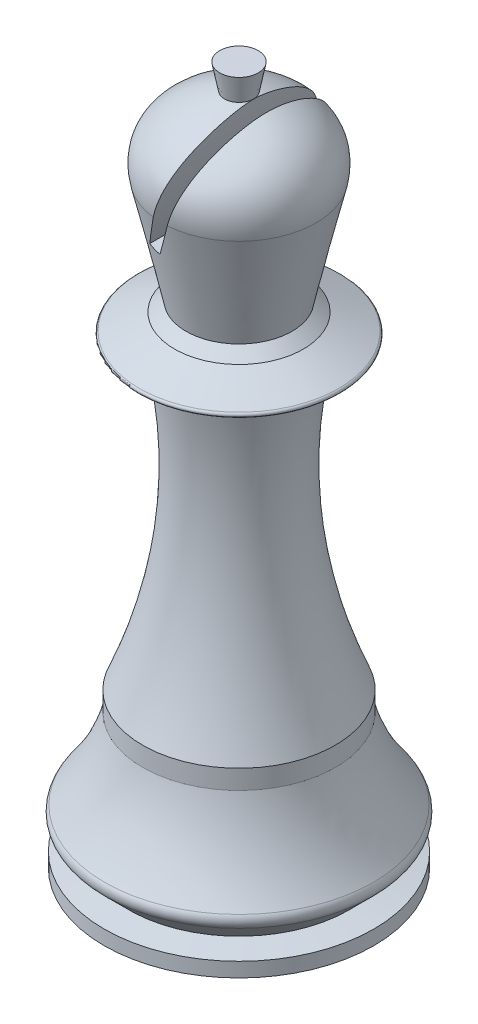
ISO-10303-21;
HEADER;
FILE_DESCRIPTION(('STEP AP214'),'2;1');
FILE_NAME('part.step','',(''),(''),'','','');
FILE_SCHEMA(('AUTOMOTIVE_DESIGN { 1 0 10303 214 1 1 1 1 }'));
ENDSEC;
DATA;
#1=APPLICATION_CONTEXT('core data for automotive mechanical design processes');
#2=APPLICATION_PROTOCOL_DEFINITION('international standard','automotive_design',2000,#1);
#3=PRODUCT_CONTEXT('',#1,'mechanical');
#4=PRODUCT('Part','Part','',(#3));
#5=PRODUCT_RELATED_PRODUCT_CATEGORY('part','',(#4));
#6=PRODUCT_DEFINITION_FORMATION('','',#4);
#7=PRODUCT_DEFINITION_CONTEXT('part definition',#1,'design');
#8=PRODUCT_DEFINITION('design','',#6,#7);
#9=PRODUCT_DEFINITION_SHAPE('','',#8);
#10=(LENGTH_UNIT() NAMED_UNIT(*) SI_UNIT(.MILLI.,.METRE.));
#11=(NAMED_UNIT(*) PLANE_ANGLE_UNIT() SI_UNIT($,.RADIAN.));
#12=(NAMED_UNIT(*) SI_UNIT($,.STERADIAN.) SOLID_ANGLE_UNIT());
#13=UNCERTAINTY_MEASURE_WITH_UNIT(LENGTH_MEASURE(1.E-05),#10,'distance_accuracy_value','');
#14=(GEOMETRIC_REPRESENTATION_CONTEXT(3) GLOBAL_UNCERTAINTY_ASSIGNED_CONTEXT((#13)) GLOBAL_UNIT_ASSIGNED_CONTEXT((#10,
#11,#12)) REPRESENTATION_CONTEXT('',''));
#15=CARTESIAN_POINT('',(0.,0.,0.));
#16=DIRECTION('',(0.,0.,1.));
#17=DIRECTION('',(1.,0.,0.));
#18=AXIS2_PLACEMENT_3D('',#15,#16,#17);
#19=CARTESIAN_POINT('',(8.,61.970366821396,0.));
#20=CARTESIAN_POINT('',(9.00820559247784,66.7482351537256,0.));
#21=CARTESIAN_POINT('',(4.83118187357688,68.8516572764192,0.));
#22=CARTESIAN_POINT('',(1.5,69.8668460847592,0.));
#23=B_SPLINE_CURVE_WITH_KNOTS('',3,(#19,#20,#21,#22),.UNSPECIFIED.,.F.,.F.,(4,4),(0.,1.),.UNSPECIFIED.);
#24=CARTESIAN_POINT('',(0.,69.970366821396,0.));
#25=DIRECTION('',(0.,1.,0.));
#26=AXIS1_PLACEMENT('',#24,#25);
#27=SURFACE_OF_REVOLUTION('',#23,#26);
#28=CARTESIAN_POINT('',(0.,61.970366821396,0.));
#29=DIRECTION('',(0.,1.,0.));
#30=DIRECTION('',(-1.,0.,0.));
#31=AXIS2_PLACEMENT_3D('',#28,#29,#30);
#32=CIRCLE('',#31,8.);
#33=CARTESIAN_POINT('',(0.534835953692726,61.970366821396,7.98210188500734));
#34=VERTEX_POINT('',#33);
#35=CARTESIAN_POINT('',(0.534835953692727,61.970366821396,-7.98210188500734));
#36=VERTEX_POINT('',#35);
#37=EDGE_CURVE('E191',#34,#36,#32,.T.);
#38=ORIENTED_EDGE('',*,*,#37,.T.);
#39=CARTESIAN_POINT('',(0.53483595369273,61.970366821396,-7.98210188500733));
#40=CARTESIAN_POINT('',(0.578248073847116,62.0784401438668,-8.00204917051532));
#41=CARTESIAN_POINT('',(0.621476780237141,62.1870817611524,-8.01942855153003));
#42=CARTESIAN_POINT('',(0.707548439255658,62.4054863762713,-8.04867899450786));
#43=CARTESIAN_POINT('',(0.750390539111129,62.5152510651595,-8.06053989679689));
#44=CARTESIAN_POINT('',(0.835534248462968,62.7355510942813,-8.07830979721081));
#45=CARTESIAN_POINT('',(0.877835537763532,62.8460868361471,-8.08421541715229));
#46=CARTESIAN_POINT('',(0.961932335548767,63.0680439884857,-8.08967261393527));
#47=CARTESIAN_POINT('',(1.00372498017465,63.1794671692388,-8.08919744883406));
#48=CARTESIAN_POINT('',(1.08646974763353,63.4023286574135,-8.08144527813009));
#49=CARTESIAN_POINT('',(1.1274223191167,63.5137669229821,-8.0741720051694));
#50=CARTESIAN_POINT('',(1.20835295750824,63.7362648099618,-8.05249569970204));
#51=CARTESIAN_POINT('',(1.24833132799302,63.8473245398065,-8.03809491883728));
#52=CARTESIAN_POINT('',(1.33781512957097,64.0984932600098,-7.99700684823349));
#53=CARTESIAN_POINT('',(1.38698288561287,64.2383606832297,-7.96805368294083));
#54=CARTESIAN_POINT('',(1.48321811357185,64.5157320239732,-7.8978877152229));
#55=CARTESIAN_POINT('',(1.5302855360558,64.6532358858217,-7.85667462442473));
#56=CARTESIAN_POINT('',(1.62189547932326,64.924368462772,-7.76212866017743));
#57=CARTESIAN_POINT('',(1.66644523129193,65.0580076746154,-7.70883295904614));
#58=CARTESIAN_POINT('',(1.75293932752481,65.3207979064284,-7.59038975800287));
#59=CARTESIAN_POINT('',(1.79488368625388,65.449948951314,-7.52524232389827));
#60=CARTESIAN_POINT('',(1.87596178634435,65.7027170473521,-7.38382880892069));
#61=CARTESIAN_POINT('',(1.91509867912382,65.826340242935,-7.30757549554513));
#62=CARTESIAN_POINT('',(1.99053986328471,66.0675151985333,-7.14478958892181));
#63=CARTESIAN_POINT('',(2.0268441618533,66.1850669739536,-7.05825702175711));
#64=CARTESIAN_POINT('',(2.09666194186866,66.4137524253518,-6.87586250118639));
#65=CARTESIAN_POINT('',(2.13017270067729,66.5248798084025,-6.77999163930094));
#66=CARTESIAN_POINT('',(2.19445542268015,66.7404097973101,-6.58003862519069));
#67=CARTESIAN_POINT('',(2.22522588200872,66.8448087020269,-6.4759520225834));
#68=CARTESIAN_POINT('',(2.29772520577298,67.0933660212783,-6.21100260429954));
#69=CARTESIAN_POINT('',(2.33796408021475,67.2336586737514,-6.0460920494396));
#70=CARTESIAN_POINT('',(2.41332383329704,67.5000335258428,-5.70405152328033));
#71=CARTESIAN_POINT('',(2.44844197588729,67.6261081205409,-5.52691509351923));
#72=CARTESIAN_POINT('',(2.51421073927249,67.8651905184621,-5.16215528290196));
#73=CARTESIAN_POINT('',(2.5448410548901,67.9781384813933,-4.97448924828309));
#74=CARTESIAN_POINT('',(2.60192827703927,68.1910432837729,-4.59136773421476));
#75=CARTESIAN_POINT('',(2.62838537050774,68.2910007050893,-4.39591260416457));
#76=CARTESIAN_POINT('',(2.67471335028323,68.4678101461697,-4.02135595347143));
#77=CARTESIAN_POINT('',(2.6949912364531,68.5459971399531,-3.84293069621768));
#78=CARTESIAN_POINT('',(2.73277264903776,68.6928510025025,-3.48186406735148));
#79=CARTESIAN_POINT('',(2.75027542788745,68.761515305401,-3.29922157481857));
#80=CARTESIAN_POINT('',(2.78261039261548,68.8892605363006,-2.93029316885146));
#81=CARTESIAN_POINT('',(2.79744139739984,68.9483372248283,-2.7440056842429));
#82=CARTESIAN_POINT('',(2.82435952371665,69.0561963941671,-2.36925374779074));
#83=CARTESIAN_POINT('',(2.83645960819063,69.1050274270978,-2.18080424226932));
#84=CARTESIAN_POINT('',(2.85789566079208,69.1919380141196,-1.80134524198184));
#85=CARTESIAN_POINT('',(2.86723267446328,69.2300216347692,-1.61033674420853));
#86=CARTESIAN_POINT('',(2.88294021525425,69.2942971996794,-1.22626075786964));
#87=CARTESIAN_POINT('',(2.88931192009693,69.3204938649434,-1.03319411794826));
#88=CARTESIAN_POINT('',(2.898728615058,69.3592733945348,-0.650563459545809));
#89=CARTESIAN_POINT('',(2.90185413701353,69.3721857375679,-0.461035336280652));
#90=CARTESIAN_POINT('',(2.90490341928859,69.3847826173665,-0.0814669961231008));
#91=CARTESIAN_POINT('',(2.90482655217017,69.3844645619254,0.10857331382765));
#92=CARTESIAN_POINT('',(2.90147395879796,69.3706157265811,0.488112813790388));
#93=CARTESIAN_POINT('',(2.8981985715723,69.3570863470165,0.677612059017686));
#94=CARTESIAN_POINT('',(2.88859951465409,69.3175648891484,1.05575542394565));
#95=CARTESIAN_POINT('',(2.88226714373377,69.2915372375907,1.24439554160072));
#96=CARTESIAN_POINT('',(2.8667769543981,69.2281629684164,1.61967290239496));
#97=CARTESIAN_POINT('',(2.85761842075592,69.1908134855868,1.80630962614191));
#98=CARTESIAN_POINT('',(2.83666617594678,69.1058654228157,2.17709066226512));
#99=CARTESIAN_POINT('',(2.824872229597,69.0582659281826,2.36123475064354));
#100=CARTESIAN_POINT('',(2.80064325536387,68.9611548147941,2.70012987040346));
#101=CARTESIAN_POINT('',(2.78854875295653,68.9129196891685,2.85527362359829));
#102=CARTESIAN_POINT('',(2.76251579200016,68.8097771802947,3.16310962500207));
#103=CARTESIAN_POINT('',(2.74857799376161,68.7548721869157,3.31580272922768));
#104=CARTESIAN_POINT('',(2.71881044883495,68.6384621763262,3.61847872933636));
#105=CARTESIAN_POINT('',(2.70298057622307,68.576956719861,3.76846144406853));
#106=CARTESIAN_POINT('',(2.66936161220449,68.4473747822673,4.0651241713372));
#107=CARTESIAN_POINT('',(2.65157486615007,68.3793061790458,4.21180788910546));
#108=CARTESIAN_POINT('',(2.61389837894279,68.236367563342,4.50156377482297));
#109=CARTESIAN_POINT('',(2.59400871986199,68.1614978163096,4.64463608344783));
#110=CARTESIAN_POINT('',(2.55197817234946,68.0047660341975,4.92646977170909));
#111=CARTESIAN_POINT('',(2.52983774748534,67.9229054395057,5.06523203138769));
#112=CARTESIAN_POINT('',(2.45434865163817,67.6465763032446,5.50551450694555));
#113=CARTESIAN_POINT('',(2.39609084158585,67.4373734232772,5.79744139527686));
#114=CARTESIAN_POINT('',(2.29796463142651,67.0945193073289,6.20785269064008));
#115=CARTESIAN_POINT('',(2.26348604265967,66.9754602329392,6.34001695883857));
#116=CARTESIAN_POINT('',(2.19065043245322,66.7274278023996,6.59360883029425));
#117=CARTESIAN_POINT('',(2.15229407925964,66.5984561553753,6.7150382767205));
#118=CARTESIAN_POINT('',(2.07774670798809,66.3514469269135,6.92751994087815));
#119=CARTESIAN_POINT('',(2.0421309326032,66.234781341631,7.02037112527957));
#120=CARTESIAN_POINT('',(1.96795261358776,65.994895530155,7.1958856826278));
#121=CARTESIAN_POINT('',(1.92939036296265,65.8716759560771,7.278550066447));
#122=CARTESIAN_POINT('',(1.84939376673229,65.6194188561563,7.43259024028926));
#123=CARTESIAN_POINT('',(1.80796220090675,65.4903870024518,7.50397674217486));
#124=CARTESIAN_POINT('',(1.72232272130267,65.227254702115,7.6347463845447));
#125=CARTESIAN_POINT('',(1.67811481373345,65.0931542668189,7.69412955187329));
#126=CARTESIAN_POINT('',(1.58713824477781,64.8209331847579,7.80038903238915));
#127=CARTESIAN_POINT('',(1.54036963721879,64.6828126225271,7.84726560835066));
#128=CARTESIAN_POINT('',(1.44454998643246,64.4036849360872,7.92837409591659));
#129=CARTESIAN_POINT('',(1.39549883388348,64.2626776738023,7.96260540117704));
#130=CARTESIAN_POINT('',(1.29531269231276,63.9785757192432,8.01869772712675));
#131=CARTESIAN_POINT('',(1.2441730373806,63.8354768696887,8.04052921946331));
#132=CARTESIAN_POINT('',(1.14025962564182,63.5486035661954,8.07220960206265));
#133=CARTESIAN_POINT('',(1.08748602862569,63.4048291794796,8.08205966027159));
#134=CARTESIAN_POINT('',(0.953049181679102,63.0434058453686,8.09266412408669));
#135=CARTESIAN_POINT('',(0.87050266369623,62.825838308302,8.08612327856477));
#136=CARTESIAN_POINT('',(0.745361113708041,62.502343128492,8.05920471707769));
#137=CARTESIAN_POINT('',(0.703544060582202,62.3952787064052,8.04743641902176));
#138=CARTESIAN_POINT('',(0.619491871695956,62.1820951838672,8.01862731014028));
#139=CARTESIAN_POINT('',(0.577256986309394,62.0759755820561,8.00158949121919));
#140=CARTESIAN_POINT('',(0.534835953692732,61.970366821396,7.98210188500734));
#141=B_SPLINE_CURVE_WITH_KNOTS('',3,(#39,#40,#41,#42,#43,#44,#45,#46,#47,#48,#49,#50,#51,#52,
#53,#54,#55,#56,#57,#58,#59,#60,#61,#62,#63,#64,#65,#66,#67,#68,#69,#70,#71,#72,#73,#74,#75,#76,
#77,#78,#79,#80,#81,#82,#83,#84,#85,#86,#87,#88,#89,#90,#91,#92,#93,#94,#95,#96,#97,#98,#99,
#100,#101,#102,#103,#104,#105,#106,#107,#108,#109,#110,#111,#112,#113,#114,#115,#116,#117,#118,
#119,#120,#121,#122,#123,#124,#125,#126,#127,#128,#129,#130,#131,#132,#133,#134,#135,#136,#137,
#138,#139,#140),.UNSPECIFIED.,.F.,.F.,(4,2,2,2,2,2,2,2,2,2,2,2,2,2,2,2,2,2,2,2,2,2,2,2,2,2,2,2,
2,2,2,2,2,2,2,2,2,2,2,2,2,2,2,2,2,2,2,2,2,2,4),(0.,0.354485928617171,0.709621918290781,
1.06495924867334,1.4217862649791,1.77841747303533,2.13493609002427,2.58758327804275,
3.04024111388357,3.49152479820131,3.94280597681864,4.39357239151397,4.84433766243676,
5.29553724307847,5.74698293371819,6.40660848926784,7.0665852069165,7.72946142730708,
8.39230794613157,8.97957962456564,9.56700923585299,10.1546978945271,10.7395353658363,
11.3241512513111,11.9085347480541,12.4780468688758,13.0476705736423,13.6172339075187,
14.1884280596426,14.7597668845743,15.3311567158514,15.819751182737,16.3081710956757,
16.7966235326869,17.2844967990258,17.7723510317663,18.2601049888609,19.3473923827849,
19.89048930341,20.4334927924354,20.8929275101506,21.3523165997516,21.8112666984164,
22.2702157706705,22.7291551992509,23.1881166312393,23.6481664794806,24.1081714786229,
24.8050433895983,25.1515737647633,25.4979077485702),.UNSPECIFIED.);
#142=EDGE_CURVE('E140',#36,#34,#141,.T.);
#143=ORIENTED_EDGE('',*,*,#142,.T.);
#144=EDGE_LOOP('',(#38,#143));
#145=FACE_BOUND('',#144,.T.);
#146=ADVANCED_FACE('F32',(#145),#27,.T.);
#147=CARTESIAN_POINT('',(0.,-0.0296331786040218,0.));
#148=DIRECTION('',(0.,1.,0.));
#149=DIRECTION('',(-1.,0.,0.));
#150=AXIS2_PLACEMENT_3D('',#147,#148,#149);
#151=PLANE('',#150);
#152=CARTESIAN_POINT('',(0.,-0.0296331786040216,0.));
#153=DIRECTION('',(0.,1.,0.));
#154=DIRECTION('',(-1.,0.,0.));
#155=AXIS2_PLACEMENT_3D('',#152,#153,#154);
#156=CIRCLE('',#155,14.);
#157=CARTESIAN_POINT('',(-14.,-0.0296331786040219,0.));
#158=VERTEX_POINT('',#157);
#159=EDGE_CURVE('E163',#158,#158,#156,.T.);
#160=ORIENTED_EDGE('',*,*,#159,.F.);
#161=EDGE_LOOP('',(#160));
#162=FACE_BOUND('',#161,.T.);
#163=ADVANCED_FACE('F217',(#162),#151,.F.);
#164=CARTESIAN_POINT('',(0.,72.470366821396,0.));
#165=DIRECTION('',(0.,-1.,0.));
#166=DIRECTION('',(1.,0.,0.));
#167=AXIS2_PLACEMENT_3D('',#164,#165,#166);
#168=PLANE('',#167);
#169=CARTESIAN_POINT('',(0.,72.470366821396,0.));
#170=DIRECTION('',(0.,1.,0.));
#171=DIRECTION('',(-1.,0.,0.));
#172=AXIS2_PLACEMENT_3D('',#169,#170,#171);
#173=CIRCLE('',#172,2.);
#174=CARTESIAN_POINT('',(-2.,72.470366821396,0.));
#175=VERTEX_POINT('',#174);
#176=EDGE_CURVE('E195',#175,#175,#173,.T.);
#177=ORIENTED_EDGE('',*,*,#176,.T.);
#178=EDGE_LOOP('',(#177));
#179=FACE_BOUND('',#178,.T.);
#180=ADVANCED_FACE('F221',(#179),#168,.F.);
#181=CARTESIAN_POINT('',(0.,69.8668460847592,0.));
#182=DIRECTION('',(0.,1.,0.));
#183=DIRECTION('',(-1.,0.,0.));
#184=AXIS2_PLACEMENT_3D('',#181,#182,#183);
#185=CONICAL_SURFACE('',#184,1.5,0.189737492979221);
#186=ORIENTED_EDGE('',*,*,#176,.F.);
#187=EDGE_LOOP('',(#186));
#188=FACE_BOUND('',#187,.T.);
#189=CARTESIAN_POINT('',(0.,69.8668460847592,0.));
#190=DIRECTION('',(0.,1.,0.));
#191=DIRECTION('',(-1.,0.,0.));
#192=AXIS2_PLACEMENT_3D('',#189,#190,#191);
#193=CIRCLE('',#192,1.5);
#194=CARTESIAN_POINT('',(-1.5,69.8668460847592,0.));
#195=VERTEX_POINT('',#194);
#196=EDGE_CURVE('E192',#195,#195,#193,.T.);
#197=ORIENTED_EDGE('',*,*,#196,.T.);
#198=EDGE_LOOP('',(#197));
#199=FACE_BOUND('',#198,.T.);
#200=ADVANCED_FACE('F151',(#188,#199),#185,.T.);
#201=ORIENTED_EDGE('',*,*,#196,.F.);
#202=EDGE_LOOP('',(#201));
#203=FACE_BOUND('',#202,.T.);
#204=CARTESIAN_POINT('',(-0.96531922475324,61.970366821396,-7.94154637298819));
#205=VERTEX_POINT('',#204);
#206=CARTESIAN_POINT('',(-0.965319224753239,61.970366821396,7.94154637298819));
#207=VERTEX_POINT('',#206);
#208=EDGE_CURVE('E98',#205,#207,#32,.T.);
#209=ORIENTED_EDGE('',*,*,#208,.T.);
#210=CARTESIAN_POINT('',(-0.965319224753241,61.970366821396,7.94154637298819));
#211=CARTESIAN_POINT('',(-0.923115019764991,62.0754164507909,7.96900532859042));
#212=CARTESIAN_POINT('',(-0.881012714847106,62.1811788022909,7.99396973155064));
#213=CARTESIAN_POINT('',(-0.797027605055707,62.3941409557227,8.03855791772596));
#214=CARTESIAN_POINT('',(-0.755145349225603,62.5013430518232,8.05817175167221));
#215=CARTESIAN_POINT('',(-0.671748449055315,62.7168697794648,8.09161262505578));
#216=CARTESIAN_POINT('',(-0.630234032047347,62.8251950260817,8.10543630115832));
#217=CARTESIAN_POINT('',(-0.54752001541522,63.0431527657534,8.1269215267443));
#218=CARTESIAN_POINT('',(-0.506322724591494,63.1527889719581,8.13455459888822));
#219=CARTESIAN_POINT('',(-0.424585006986918,63.37250696438,8.14314584529181));
#220=CARTESIAN_POINT('',(-0.384044231036156,63.4825884720327,8.1441076923267));
#221=CARTESIAN_POINT('',(-0.303751631682722,63.7028378285285,8.1389945639395));
#222=CARTESIAN_POINT('',(-0.263999558714682,63.8130056382125,8.13292185174799));
#223=CARTESIAN_POINT('',(-0.175533007161214,64.0607137478687,8.11096614112886));
#224=CARTESIAN_POINT('',(-0.127078784787141,64.1981701388419,8.09300003384211));
#225=CARTESIAN_POINT('',(-0.0319293021507873,64.471608238056,8.04510122944678));
#226=CARTESIAN_POINT('',(0.0147659361477167,64.6075899278676,8.01516838296818));
#227=CARTESIAN_POINT('',(0.105973688836415,64.8766509175958,7.94327381408066));
#228=CARTESIAN_POINT('',(0.150491831677386,65.0097371473245,7.90134526511549));
#229=CARTESIAN_POINT('',(0.237218025345246,65.2723334273208,7.80559261718437));
#230=CARTESIAN_POINT('',(0.279426100751869,65.4018435156323,7.75176864481962));
#231=CARTESIAN_POINT('',(0.361343117508346,65.6563646975656,7.63270040282973));
#232=CARTESIAN_POINT('',(0.401051364347402,65.7813745368189,7.56745297837311));
#233=CARTESIAN_POINT('',(0.477833645290183,66.0260699898455,7.42632055171477));
#234=CARTESIAN_POINT('',(0.514907670750515,66.1457555861485,7.3504355146114));
#235=CARTESIAN_POINT('',(0.586375329230235,66.3792128979134,7.18901123319237));
#236=CARTESIAN_POINT('',(0.620769557768505,66.492985925416,7.10347414421125));
#237=CARTESIAN_POINT('',(0.686930589900172,66.7143366812645,6.92378161698758));
#238=CARTESIAN_POINT('',(0.718696687832206,66.8219127433658,6.82962387827774));
#239=CARTESIAN_POINT('',(0.793083100382043,67.076567838345,6.59076856492964));
#240=CARTESIAN_POINT('',(0.834347887771038,67.2202612368626,6.44202741162685));
#241=CARTESIAN_POINT('',(0.912055516977583,67.4947472510702,6.13190151445469));
#242=CARTESIAN_POINT('',(0.948495807130659,67.6255330307185,5.97051015118987));
#243=CARTESIAN_POINT('',(1.01731570681384,67.8758146422563,5.63635096193235));
#244=CARTESIAN_POINT('',(1.04966031792706,67.9952112632156,5.46350211125103));
#245=CARTESIAN_POINT('',(1.11044307101181,68.2223503006899,5.1097704878131));
#246=CARTESIAN_POINT('',(1.138882305211,68.3300959738587,4.92888998009695));
#247=CARTESIAN_POINT('',(1.18737729036026,68.5159037612199,4.59477275479823));
#248=CARTESIAN_POINT('',(1.20801059266399,68.5957694513422,4.44261367772804));
#249=CARTESIAN_POINT('',(1.24721352813707,68.7488267565043,4.13465658209969));
#250=CARTESIAN_POINT('',(1.26578246896879,68.8220161309988,3.97885736379763));
#251=CARTESIAN_POINT('',(1.30103860361414,68.9620911225476,3.66408041272758));
#252=CARTESIAN_POINT('',(1.31772408717942,69.0289710014421,3.50509994301969));
#253=CARTESIAN_POINT('',(1.34934064154859,69.1566329166579,3.18433145468383));
#254=CARTESIAN_POINT('',(1.36426971469847,69.2174079984212,3.02254047491528));
#255=CARTESIAN_POINT('',(1.3922631558527,69.3321322080568,2.69844824483864));
#256=CARTESIAN_POINT('',(1.405346527317,69.3861501325091,2.53617298156906));
#257=CARTESIAN_POINT('',(1.42982185425413,69.4878024781064,2.20959276335302));
#258=CARTESIAN_POINT('',(1.44121467660457,69.5354401696698,2.04528889577941));
#259=CARTESIAN_POINT('',(1.46215827790586,69.6234610027959,1.71481451601076));
#260=CARTESIAN_POINT('',(1.47171105418372,69.6638520071646,1.54864623738468));
#261=CARTESIAN_POINT('',(1.48862500220284,69.7356573609512,1.21430251727441));
#262=CARTESIAN_POINT('',(1.49598743654762,69.767076881481,1.04612829048389));
#263=CARTESIAN_POINT('',(1.50506839972406,69.8059313521729,0.787477850547021));
#264=CARTESIAN_POINT('',(1.50781234643385,69.8176947579626,0.697687017265269));
#265=CARTESIAN_POINT('',(1.51237887021273,69.8372914909902,0.517674753128038));
#266=CARTESIAN_POINT('',(1.51420175771772,69.8451261423778,0.427453477712773));
#267=CARTESIAN_POINT('',(1.51682246602147,69.8563948280234,0.246789186225281));
#268=CARTESIAN_POINT('',(1.51762111451573,69.859832415577,0.156346408448912));
#269=CARTESIAN_POINT('',(1.51814122143658,69.8620707390486,-0.0245337542694771));
#270=CARTESIAN_POINT('',(1.51786348267405,69.860874930731,-0.114971092941237));
#271=CARTESIAN_POINT('',(1.51625076164867,69.8539365392709,-0.295825217692543));
#272=CARTESIAN_POINT('',(1.51491382215003,69.8481855388571,-0.386241655458916));
#273=CARTESIAN_POINT('',(1.51126356421842,69.8325037862875,-0.566762473457962));
#274=CARTESIAN_POINT('',(1.50894940348809,69.8225694283864,-0.656866516719725));
#275=CARTESIAN_POINT('',(1.50345888920605,69.7990407945888,-0.836652457494096));
#276=CARTESIAN_POINT('',(1.50028168620165,69.7854429129632,-0.926333850066567));
#277=CARTESIAN_POINT('',(1.49317952546897,69.7551120040854,-1.10516618379715));
#278=CARTESIAN_POINT('',(1.48925425486393,69.7383776650693,-1.19431688684972));
#279=CARTESIAN_POINT('',(1.47726631239639,69.6873969264913,-1.44504443541439));
#280=CARTESIAN_POINT('',(1.46845368085839,69.6500573046156,-1.60595816389718));
#281=CARTESIAN_POINT('',(1.44907225141615,69.5683990389332,-1.92581713284597));
#282=CARTESIAN_POINT('',(1.43850393108434,69.5240822931749,-2.08476289602726));
#283=CARTESIAN_POINT('',(1.41577481709228,69.4293710470169,-2.40076751962235));
#284=CARTESIAN_POINT('',(1.40361353488883,69.3789746824436,-2.55782578496321));
#285=CARTESIAN_POINT('',(1.37773877258473,69.2724916869532,-2.86993871360739));
#286=CARTESIAN_POINT('',(1.36402468106638,69.2164028155223,-3.02499256071116));
#287=CARTESIAN_POINT('',(1.33493772263244,69.0983359631081,-3.33356349070495));
#288=CARTESIAN_POINT('',(1.31955706536198,69.0363305014971,-3.48706933738183));
#289=CARTESIAN_POINT('',(1.28710322965749,68.9065650894303,-3.79137379786208));
#290=CARTESIAN_POINT('',(1.27003077788626,68.8388076113688,-3.94217354140506));
#291=CARTESIAN_POINT('',(1.23405978311621,68.6972987793404,-4.24060895224829));
#292=CARTESIAN_POINT('',(1.21516234046526,68.6235510413116,-4.38824646135905));
#293=CARTESIAN_POINT('',(1.17536708521002,68.4697105730013,-4.67983738504501));
#294=CARTESIAN_POINT('',(1.15447003689404,68.3896202689741,-4.8237921807728));
#295=CARTESIAN_POINT('',(1.10757507267561,68.2116972214791,-5.12602190172465));
#296=CARTESIAN_POINT('',(1.08126769140444,68.1129157968288,-5.28369411778957));
#297=CARTESIAN_POINT('',(1.02549165858328,67.9060594543813,-5.59228065132307));
#298=CARTESIAN_POINT('',(0.996022873017124,67.7979841426424,-5.7431946819184));
#299=CARTESIAN_POINT('',(0.933707004122691,67.572459846722,-6.03606738937937));
#300=CARTESIAN_POINT('',(0.900875403488436,67.4550543343389,-6.17806264801915));
#301=CARTESIAN_POINT('',(0.831387941106848,67.2100527801712,-6.45195067231319));
#302=CARTESIAN_POINT('',(0.794733458176043,67.0824604163918,-6.58384705081633));
#303=CARTESIAN_POINT('',(0.724107499296825,66.8402720849726,-6.81334772937879));
#304=CARTESIAN_POINT('',(0.69079710301489,66.7273344311175,-6.91290432713893));
#305=CARTESIAN_POINT('',(0.621273363344213,66.4946134762899,-7.102458505737));
#306=CARTESIAN_POINT('',(0.585061593575143,66.374833896163,-7.19246120756193));
#307=CARTESIAN_POINT('',(0.50969181539167,66.1288128091276,-7.36169037155866));
#308=CARTESIAN_POINT('',(0.470534911515463,66.0025737304014,-7.44092084273792));
#309=CARTESIAN_POINT('',(0.389313663816827,65.7442667002449,-7.58752841447383));
#310=CARTESIAN_POINT('',(0.34724936480955,65.612198838672,-7.65490569768107));
#311=CARTESIAN_POINT('',(0.260245471149521,65.3428023577122,-7.77710870642141));
#312=CARTESIAN_POINT('',(0.215298245409759,65.2054601977575,-7.83189919962696));
#313=CARTESIAN_POINT('',(0.122881856012603,64.9270093786369,-7.92817175443332));
#314=CARTESIAN_POINT('',(0.0754126287092152,64.7859006244609,-7.96965347998393));
#315=CARTESIAN_POINT('',(-0.0218795146463878,64.5007179071666,-8.03930857726954));
#316=CARTESIAN_POINT('',(-0.0717094334450718,64.3566359436033,-8.06743922189746));
#317=CARTESIAN_POINT('',(-0.173225794346524,64.0671710880415,-8.11048161520816));
#318=CARTESIAN_POINT('',(-0.224912174072605,63.9217882398754,-8.12539380759657));
#319=CARTESIAN_POINT('',(-0.314115687068398,63.6742926983776,-8.14004145189206));
#320=CARTESIAN_POINT('',(-0.351257102992976,63.5722174497894,-8.14297840006046));
#321=CARTESIAN_POINT('',(-0.426166091672205,63.3682808445925,-8.14292881157277));
#322=CARTESIAN_POINT('',(-0.463933750897343,63.2664195197469,-8.1399414500304));
#323=CARTESIAN_POINT('',(-0.539993634087023,63.0631779886788,-8.12834486849752));
#324=CARTESIAN_POINT('',(-0.578286049157923,62.9617979768694,-8.11973354406329));
#325=CARTESIAN_POINT('',(-0.655049915921562,62.7604067356815,-8.0972803216733));
#326=CARTESIAN_POINT('',(-0.693518853444751,62.6603909296573,-8.08347062739769));
#327=CARTESIAN_POINT('',(-0.770763628227735,62.4613346448405,-8.05094535693559));
#328=CARTESIAN_POINT('',(-0.8095393332437,62.3622937831127,-8.03223179373108));
#329=CARTESIAN_POINT('',(-0.887287364934735,62.1654224172022,-7.99023591576145));
#330=CARTESIAN_POINT('',(-0.926259354207619,62.0675904554925,-7.96695982274671));
#331=CARTESIAN_POINT('',(-0.96531922475324,61.970366821396,-7.94154637298819));
#332=B_SPLINE_CURVE_WITH_KNOTS('',3,(#210,#211,#212,#213,#214,#215,#216,#217,#218,#219,#220,
#221,#222,#223,#224,#225,#226,#227,#228,#229,#230,#231,#232,#233,#234,#235,#236,#237,#238,#239,
#240,#241,#242,#243,#244,#245,#246,#247,#248,#249,#250,#251,#252,#253,#254,#255,#256,#257,#258,
#259,#260,#261,#262,#263,#264,#265,#266,#267,#268,#269,#270,#271,#272,#273,#274,#275,#276,#277,
#278,#279,#280,#281,#282,#283,#284,#285,#286,#287,#288,#289,#290,#291,#292,#293,#294,#295,#296,
#297,#298,#299,#300,#301,#302,#303,#304,#305,#306,#307,#308,#309,#310,#311,#312,#313,#314,#315,
#316,#317,#318,#319,#320,#321,#322,#323,#324,#325,#326,#327,#328,#329,#330,#331),.UNSPECIFIED.,
.F.,.F.,(4,2,2,2,2,2,2,2,2,2,2,2,2,2,2,2,2,2,2,2,2,2,2,2,2,2,2,2,2,2,2,2,2,2,2,2,2,2,2,2,2,2,2,
2,2,2,2,2,2,2,2,2,2,2,2,2,2,2,2,2,4),(0.,0.34947652609649,0.699598534076257,1.04992363667878,
1.40185126895,1.75358513564811,2.10520587033961,2.54525581488562,2.98531125235039,
3.42416131326964,3.86300670379885,4.30197348263077,4.74094170173165,5.17981209106308,
5.61879993861256,6.25046567485742,6.88246417414618,7.51954325940227,8.15644380651725,
8.67549981752328,9.19472938571606,9.71442670383585,10.2347094998762,10.7491680301652,
11.2633618386186,11.7769943168893,12.2903301399458,12.5620553015856,12.8336888191622,
13.105102688979,13.3763141669017,13.6480279730159,13.9199764572842,14.1921935838881,
14.4645248152471,14.9605641962244,15.456468867673,15.952525985083,16.4487791084057,
16.9474611476033,17.4459299127848,17.9440999889242,18.4420804095862,19.0054712288432,
19.5688859404373,20.1298142449781,20.6905409320198,21.1526961513231,21.6146023863067,
22.0763362443426,22.53806298671,23.0010668378049,23.46408237896,23.9285698681591,
24.3930417652516,24.718872567461,25.0447487407327,25.3707469242859,25.6947579392042,
26.0186361590935,26.3420757530192),.UNSPECIFIED.);
#333=EDGE_CURVE('E53',#207,#205,#332,.T.);
#334=ORIENTED_EDGE('',*,*,#333,.T.);
#335=EDGE_LOOP('',(#209,#334));
#336=FACE_BOUND('',#335,.T.);
#337=ADVANCED_FACE('F146',(#203,#336),#27,.T.);
#338=CARTESIAN_POINT('',(5.49999999999997,50.970366821396,0.));
#339=CARTESIAN_POINT('',(6.67774548529357,56.4868065221647,0.));
#340=CARTESIAN_POINT('',(8.,61.970366821396,0.));
#341=B_SPLINE_CURVE_WITH_KNOTS('',2,(#338,#339,#340),.UNSPECIFIED.,.F.,.F.,(3,3),(0.,1.),.UNSPECIFIED.);
#342=CARTESIAN_POINT('',(0.,69.970366821396,0.));
#343=DIRECTION('',(0.,1.,0.));
#344=AXIS1_PLACEMENT('',#342,#343);
#345=SURFACE_OF_REVOLUTION('',#341,#344);
#346=CARTESIAN_POINT('',(0.,58.,0.));
#347=DIRECTION('',(0.,1.,0.));
#348=DIRECTION('',(-1.,0.,0.));
#349=AXIS2_PLACEMENT_3D('',#346,#347,#348);
#350=CIRCLE('',#349,7.06255827430205);
#351=CARTESIAN_POINT('',(-2.75,58.,-6.50516943498879));
#352=VERTEX_POINT('',#351);
#353=CARTESIAN_POINT('',(-1.25,58.,-6.9510595867042));
#354=VERTEX_POINT('',#353);
#355=EDGE_CURVE('E46',#352,#354,#350,.F.);
#356=ORIENTED_EDGE('',*,*,#355,.T.);
#357=CARTESIAN_POINT('',(-1.25,58.,-6.9510595867042));
#358=CARTESIAN_POINT('',(-1.16997211363908,58.16039805632,-7.00310871246554));
#359=CARTESIAN_POINT('',(-1.09054871630935,58.321574844895,-7.0536698378458));
#360=CARTESIAN_POINT('',(-0.933048711455199,58.6452607537393,-7.15206429643314));
#361=CARTESIAN_POINT('',(-0.854971186367632,58.807768845058,-7.19989954385456));
#362=CARTESIAN_POINT('',(-0.700218297359895,59.1340540164711,-7.2931446283825));
#363=CARTESIAN_POINT('',(-0.623542373766654,59.2978305511501,-7.33855544814269));
#364=CARTESIAN_POINT('',(-0.471639370704869,59.6265978296291,-7.4272241790783));
#365=CARTESIAN_POINT('',(-0.39641205412459,59.7915883685012,-7.47048244445751));
#366=CARTESIAN_POINT('',(-0.247459263950959,60.1227096336063,-7.55509349603483));
#367=CARTESIAN_POINT('',(-0.173733638543172,60.2888402422902,-7.59644647538783));
#368=CARTESIAN_POINT('',(-0.0278085448027315,60.6222242834604,-7.67748952562116));
#369=CARTESIAN_POINT('',(0.044390543819255,60.7894779819841,-7.71717918512339));
#370=CARTESIAN_POINT('',(0.187230271235514,61.125070441079,-7.79511643846095));
#371=CARTESIAN_POINT('',(0.257870238002266,61.2934096306378,-7.8333634153059));
#372=CARTESIAN_POINT('',(0.397563608209646,61.6311388057725,-7.90861843267243));
#373=CARTESIAN_POINT('',(0.466616078119951,61.8005293388199,-7.9456257497748));
#374=CARTESIAN_POINT('',(0.534835953692723,61.970366821396,-7.98210188500734));
#375=B_SPLINE_CURVE_WITH_KNOTS('',3,(#357,#358,#359,#360,#361,#362,#363,#364,#365,#366,#367,
#368,#369,#370,#371,#372,#373,#374),.UNSPECIFIED.,.F.,.F.,(4,2,2,2,2,2,2,2,4),(0.,
0.559957543068592,1.11951689015943,1.67884769103594,2.23808614733925,2.79726778361393,
3.35658691216258,3.91614259289409,4.47601931390278),.UNSPECIFIED.);
#376=EDGE_CURVE('E11',#354,#36,#375,.T.);
#377=ORIENTED_EDGE('',*,*,#376,.T.);
#378=ORIENTED_EDGE('',*,*,#37,.F.);
#379=CARTESIAN_POINT('',(0.534835953692725,61.970366821396,7.98210188500734));
#380=CARTESIAN_POINT('',(0.46661607811995,61.8005293388199,7.9456257497748));
#381=CARTESIAN_POINT('',(0.397563608209646,61.6311388057725,7.90861843267243));
#382=CARTESIAN_POINT('',(0.257870238002267,61.2934096306378,7.8333634153059));
#383=CARTESIAN_POINT('',(0.187230271235517,61.125070441079,7.79511643846095));
#384=CARTESIAN_POINT('',(0.0443905438192545,60.7894779819841,7.71717918512339));
#385=CARTESIAN_POINT('',(-0.0278085448027362,60.6222242834604,7.67748952562116));
#386=CARTESIAN_POINT('',(-0.17373363854318,60.2888402422902,7.59644647538783));
#387=CARTESIAN_POINT('',(-0.247459263950967,60.1227096336062,7.55509349603482));
#388=CARTESIAN_POINT('',(-0.396412054124598,59.7915883685012,7.47048244445751));
#389=CARTESIAN_POINT('',(-0.471639370704877,59.6265978296291,7.4272241790783));
#390=CARTESIAN_POINT('',(-0.623542373766663,59.2978305511501,7.33855544814269));
#391=CARTESIAN_POINT('',(-0.700218297359904,59.1340540164711,7.2931446283825));
#392=CARTESIAN_POINT('',(-0.854971186367639,58.807768845058,7.19989954385456));
#393=CARTESIAN_POINT('',(-0.933048711455205,58.6452607537393,7.15206429643313));
#394=CARTESIAN_POINT('',(-1.09054871630935,58.321574844895,7.05366983784579));
#395=CARTESIAN_POINT('',(-1.16997211363909,58.16039805632,7.00310871246554));
#396=CARTESIAN_POINT('',(-1.25,58.,6.9510595867042));
#397=B_SPLINE_CURVE_WITH_KNOTS('',3,(#379,#380,#381,#382,#383,#384,#385,#386,#387,#388,#389,
#390,#391,#392,#393,#394,#395,#396),.UNSPECIFIED.,.F.,.F.,(4,2,2,2,2,2,2,2,4),(0.,
0.55987672100868,1.11943240174019,1.67875153028885,2.23793316656354,2.79717162286685,
3.35650242374336,3.9160617708342,4.47601931390278),.UNSPECIFIED.);
#398=CARTESIAN_POINT('',(-1.25,58.,6.9510595867042));
#399=VERTEX_POINT('',#398);
#400=EDGE_CURVE('E61',#34,#399,#397,.T.);
#401=ORIENTED_EDGE('',*,*,#400,.T.);
#402=CARTESIAN_POINT('',(-2.75,58.,6.50516943498879));
#403=VERTEX_POINT('',#402);
#404=EDGE_CURVE('E90',#399,#403,#350,.F.);
#405=ORIENTED_EDGE('',*,*,#404,.T.);
#406=CARTESIAN_POINT('',(-2.75,58.,6.50516943498879));
#407=CARTESIAN_POINT('',(-2.68682018010738,58.1266795364171,6.56365828018772));
#408=CARTESIAN_POINT('',(-2.62388664882602,58.2541025849977,6.6207913731513));
#409=CARTESIAN_POINT('',(-2.49865808914838,58.5101939013577,6.7324841667067));
#410=CARTESIAN_POINT('',(-2.43636246558301,58.6388607386827,6.78704647793948));
#411=CARTESIAN_POINT('',(-2.31246609951412,58.8973737354075,6.89382027807826));
#412=CARTESIAN_POINT('',(-2.25086491465427,59.0272190363841,6.94603333525041));
#413=CARTESIAN_POINT('',(-2.12840569515974,59.2880324026872,7.04830807407592));
#414=CARTESIAN_POINT('',(-2.06754738405816,59.4190000174083,7.0983705747066));
#415=CARTESIAN_POINT('',(-1.94661862080512,59.6820050705149,7.19652784775761));
#416=CARTESIAN_POINT('',(-1.88654805529856,59.8140423504541,7.24462290544797));
#417=CARTESIAN_POINT('',(-1.7672512780536,60.0791027449774,7.33900174442862));
#418=CARTESIAN_POINT('',(-1.70802488533679,60.2121256386755,7.38528591777524));
#419=CARTESIAN_POINT('',(-1.59043297055048,60.4791565874364,7.4762164190294));
#420=CARTESIAN_POINT('',(-1.53206769436347,60.6131649081144,7.52086228434798));
#421=CARTESIAN_POINT('',(-1.41622880907405,60.8821326171245,7.60866391425054));
#422=CARTESIAN_POINT('',(-1.35875562909854,61.0170924203703,7.65181897323765));
#423=CARTESIAN_POINT('',(-1.24472967255077,61.2879309242131,7.73677716340801));
#424=CARTESIAN_POINT('',(-1.18817749371118,61.4238101464251,7.77857943273631));
#425=CARTESIAN_POINT('',(-1.07601918775208,61.6964583855819,7.86095940832037));
#426=CARTESIAN_POINT('',(-1.02041381152978,61.8332279997793,7.9015361607201));
#427=CARTESIAN_POINT('',(-0.96531922475324,61.970366821396,7.94154637298819));
#428=B_SPLINE_CURVE_WITH_KNOTS('',3,(#406,#407,#408,#409,#410,#411,#412,#413,#414,#415,#416,
#417,#418,#419,#420,#421,#422,#423,#424,#425,#426,#427),.UNSPECIFIED.,.F.,.F.,(4,2,2,2,2,2,2,2,
2,2,4),(0.,0.459488693533877,0.91850024736636,1.37720069417431,1.83572488089625,
2.29418234638313,2.75254000034158,3.21102609460425,3.66972629680094,4.12871320052839,
4.58804859332506),.UNSPECIFIED.);
#429=EDGE_CURVE('E92',#403,#207,#428,.T.);
#430=ORIENTED_EDGE('',*,*,#429,.T.);
#431=ORIENTED_EDGE('',*,*,#208,.F.);
#432=CARTESIAN_POINT('',(-0.965319224753238,61.970366821396,-7.94154637298819));
#433=CARTESIAN_POINT('',(-1.02041381152978,61.8332279997793,-7.9015361607201));
#434=CARTESIAN_POINT('',(-1.07601918775208,61.6964583855819,-7.86095940832038));
#435=CARTESIAN_POINT('',(-1.18817749371117,61.4238101464251,-7.77857943273631));
#436=CARTESIAN_POINT('',(-1.24472967255076,61.2879309242131,-7.73677716340801));
#437=CARTESIAN_POINT('',(-1.35875562909853,61.0170924203703,-7.65181897323765));
#438=CARTESIAN_POINT('',(-1.41622880907405,60.8821326171245,-7.60866391425054));
#439=CARTESIAN_POINT('',(-1.53206769436347,60.6131649081144,-7.52086228434798));
#440=CARTESIAN_POINT('',(-1.59043297055048,60.4791565874364,-7.47621641902941));
#441=CARTESIAN_POINT('',(-1.7080248853368,60.2121256386755,-7.38528591777524));
#442=CARTESIAN_POINT('',(-1.7672512780536,60.0791027449774,-7.33900174442862));
#443=CARTESIAN_POINT('',(-1.88654805529856,59.8140423504541,-7.24462290544797));
#444=CARTESIAN_POINT('',(-1.94661862080512,59.6820050705149,-7.19652784775761));
#445=CARTESIAN_POINT('',(-2.06754738405815,59.4190000174083,-7.09837057470661));
#446=CARTESIAN_POINT('',(-2.12840569515974,59.2880324026873,-7.04830807407592));
#447=CARTESIAN_POINT('',(-2.25086491465426,59.0272190363841,-6.94603333525042));
#448=CARTESIAN_POINT('',(-2.31246609951411,58.8973737354075,-6.89382027807827));
#449=CARTESIAN_POINT('',(-2.436362465583,58.6388607386827,-6.78704647793949));
#450=CARTESIAN_POINT('',(-2.49865808914838,58.5101939013577,-6.7324841667067));
#451=CARTESIAN_POINT('',(-2.62388664882601,58.2541025849977,-6.6207913731513));
#452=CARTESIAN_POINT('',(-2.68682018010738,58.1266795364171,-6.56365828018772));
#453=CARTESIAN_POINT('',(-2.75,58.,-6.50516943498879));
#454=B_SPLINE_CURVE_WITH_KNOTS('',3,(#432,#433,#434,#435,#436,#437,#438,#439,#440,#441,#442,
#443,#444,#445,#446,#447,#448,#449,#450,#451,#452,#453),.UNSPECIFIED.,.F.,.F.,(4,2,2,2,2,2,2,2,
2,2,4),(0.,0.459335392796685,0.918322296524125,1.37702249872082,1.83550859298349,
2.29386624694194,2.75232371242881,3.21084789915076,3.6695483459587,4.12855989979118,
4.58804859332506),.UNSPECIFIED.);
#455=EDGE_CURVE('E88',#205,#352,#454,.T.);
#456=ORIENTED_EDGE('',*,*,#455,.T.);
#457=EDGE_LOOP('',(#356,#377,#378,#401,#405,#430,#431,#456));
#458=FACE_BOUND('',#457,.T.);
#459=CARTESIAN_POINT('',(0.,50.970366821396,0.));
#460=DIRECTION('',(0.,1.,0.));
#461=DIRECTION('',(-1.,0.,0.));
#462=AXIS2_PLACEMENT_3D('',#459,#460,#461);
#463=CIRCLE('',#462,5.49999999999997);
#464=CARTESIAN_POINT('',(-5.49999999999997,50.970366821396,0.));
#465=VERTEX_POINT('',#464);
#466=EDGE_CURVE('E187',#465,#465,#463,.T.);
#467=ORIENTED_EDGE('',*,*,#466,.T.);
#468=EDGE_LOOP('',(#467));
#469=FACE_BOUND('',#468,.T.);
#470=ADVANCED_FACE('F95',(#458,#469),#345,.T.);
#471=CARTESIAN_POINT('',(0.,49.970366821396,0.));
#472=DIRECTION('',(0.,-1.,0.));
#473=DIRECTION('',(1.,0.,0.));
#474=AXIS2_PLACEMENT_3D('',#471,#472,#473);
#475=CONICAL_SURFACE('',#474,6.69175359259417,0.872664625997163);
#476=ORIENTED_EDGE('',*,*,#466,.F.);
#477=EDGE_LOOP('',(#476));
#478=FACE_BOUND('',#477,.T.);
#479=CARTESIAN_POINT('',(0.,49.970366821396,0.));
#480=DIRECTION('',(0.,1.,0.));
#481=DIRECTION('',(-1.,0.,0.));
#482=AXIS2_PLACEMENT_3D('',#479,#480,#481);
#483=CIRCLE('',#482,6.69175359259417);
#484=CARTESIAN_POINT('',(-6.69175359259417,49.970366821396,0.));
#485=VERTEX_POINT('',#484);
#486=EDGE_CURVE('E184',#485,#485,#483,.T.);
#487=ORIENTED_EDGE('',*,*,#486,.T.);
#488=EDGE_LOOP('',(#487));
#489=FACE_BOUND('',#488,.T.);
#490=ADVANCED_FACE('F282',(#478,#489),#475,.T.);
#491=CARTESIAN_POINT('',(0.,47.970366821396,0.));
#492=DIRECTION('',(0.,-1.,0.));
#493=DIRECTION('',(1.,0.,0.));
#494=AXIS2_PLACEMENT_3D('',#491,#492,#493);
#495=CONICAL_SURFACE('',#494,11.,1.1361752370094);
#496=CARTESIAN_POINT('',(0.,48.2681410635499,0.));
#497=DIRECTION('',(0.,1.,0.));
#498=DIRECTION('',(-1.,0.,0.));
#499=AXIS2_PLACEMENT_3D('',#496,#497,#498);
#500=CIRCLE('',#499,10.3585575955113);
#501=CARTESIAN_POINT('',(-10.3585575955113,48.2681410635499,0.));
#502=VERTEX_POINT('',#501);
#503=EDGE_CURVE('E204',#502,#502,#500,.T.);
#504=ORIENTED_EDGE('',*,*,#503,.T.);
#505=EDGE_LOOP('',(#504));
#506=FACE_BOUND('',#505,.T.);
#507=ORIENTED_EDGE('',*,*,#486,.F.);
#508=EDGE_LOOP('',(#507));
#509=FACE_BOUND('',#508,.T.);
#510=ADVANCED_FACE('F279',(#506,#509),#495,.T.);
#511=CARTESIAN_POINT('',(0.,46.970366821396,0.));
#512=DIRECTION('',(0.,1.,0.));
#513=DIRECTION('',(-1.,0.,0.));
#514=AXIS2_PLACEMENT_3D('',#511,#512,#513);
#515=CONICAL_SURFACE('',#514,7.,1.32581766366803);
#516=CARTESIAN_POINT('',(0.,47.7988480250385,0.));
#517=DIRECTION('',(0.,-1.,0.));
#518=DIRECTION('',(1.,0.,0.));
#519=AXIS2_PLACEMENT_3D('',#516,#517,#518);
#520=CIRCLE('',#519,10.3139248145701);
#521=CARTESIAN_POINT('',(10.3139248145701,47.7988480250385,0.));
#522=VERTEX_POINT('',#521);
#523=EDGE_CURVE('E207',#522,#522,#520,.T.);
#524=ORIENTED_EDGE('',*,*,#523,.T.);
#525=EDGE_LOOP('',(#524));
#526=FACE_BOUND('',#525,.T.);
#527=CARTESIAN_POINT('',(0.,46.970366821396,0.));
#528=DIRECTION('',(0.,1.,0.));
#529=DIRECTION('',(-1.,0.,0.));
#530=AXIS2_PLACEMENT_3D('',#527,#528,#529);
#531=CIRCLE('',#530,7.);
#532=CARTESIAN_POINT('',(-7.,46.970366821396,0.));
#533=VERTEX_POINT('',#532);
#534=EDGE_CURVE('E181',#533,#533,#531,.T.);
#535=ORIENTED_EDGE('',*,*,#534,.T.);
#536=EDGE_LOOP('',(#535));
#537=FACE_BOUND('',#536,.T.);
#538=ADVANCED_FACE('F259',(#526,#537),#515,.T.);
#539=CARTESIAN_POINT('',(10.,16.,0.));
#540=CARTESIAN_POINT('',(3.7057459729172,31.3766382494571,0.));
#541=CARTESIAN_POINT('',(7.,46.970366821396,0.));
#542=B_SPLINE_CURVE_WITH_KNOTS('',2,(#539,#540,#541),.UNSPECIFIED.,.F.,.F.,(3,3),(0.,1.),.UNSPECIFIED.);
#543=CARTESIAN_POINT('',(0.,69.970366821396,0.));
#544=DIRECTION('',(0.,1.,0.));
#545=AXIS1_PLACEMENT('',#543,#544);
#546=SURFACE_OF_REVOLUTION('',#542,#545);
#547=ORIENTED_EDGE('',*,*,#534,.F.);
#548=EDGE_LOOP('',(#547));
#549=FACE_BOUND('',#548,.T.);
#550=CARTESIAN_POINT('',(0.,16.,0.));
#551=DIRECTION('',(0.,1.,0.));
#552=DIRECTION('',(-1.,0.,0.));
#553=AXIS2_PLACEMENT_3D('',#550,#551,#552);
#554=CIRCLE('',#553,10.);
#555=CARTESIAN_POINT('',(-10.,16.,0.));
#556=VERTEX_POINT('',#555);
#557=EDGE_CURVE('E178',#556,#556,#554,.T.);
#558=ORIENTED_EDGE('',*,*,#557,.T.);
#559=EDGE_LOOP('',(#558));
#560=FACE_BOUND('',#559,.T.);
#561=ADVANCED_FACE('F253',(#549,#560),#546,.T.);
#562=CARTESIAN_POINT('',(0.,69.970366821396,0.));
#563=DIRECTION('',(0.,1.,0.));
#564=DIRECTION('',(-1.,0.,0.));
#565=AXIS2_PLACEMENT_3D('',#562,#563,#564);
#566=CYLINDRICAL_SURFACE('',#565,10.);
#567=ORIENTED_EDGE('',*,*,#557,.F.);
#568=EDGE_LOOP('',(#567));
#569=FACE_BOUND('',#568,.T.);
#570=CARTESIAN_POINT('',(0.,14.,0.));
#571=DIRECTION('',(0.,1.,0.));
#572=DIRECTION('',(-1.,0.,0.));
#573=AXIS2_PLACEMENT_3D('',#570,#571,#572);
#574=CIRCLE('',#573,10.);
#575=CARTESIAN_POINT('',(-10.,14.,0.));
#576=VERTEX_POINT('',#575);
#577=EDGE_CURVE('E175',#576,#576,#574,.T.);
#578=ORIENTED_EDGE('',*,*,#577,.T.);
#579=EDGE_LOOP('',(#578));
#580=FACE_BOUND('',#579,.T.);
#581=ADVANCED_FACE('F248',(#569,#580),#566,.T.);
#582=CARTESIAN_POINT('',(14.5,4.97036682139598,0.));
#583=CARTESIAN_POINT('',(11.2030561958805,8.98236864296532,0.));
#584=CARTESIAN_POINT('',(10.,14.,0.));
#585=B_SPLINE_CURVE_WITH_KNOTS('',2,(#582,#583,#584),.UNSPECIFIED.,.F.,.F.,(3,3),(0.,1.),.UNSPECIFIED.);
#586=CARTESIAN_POINT('',(0.,69.970366821396,0.));
#587=DIRECTION('',(0.,1.,0.));
#588=AXIS1_PLACEMENT('',#586,#587);
#589=SURFACE_OF_REVOLUTION('',#585,#588);
#590=CARTESIAN_POINT('',(0.,5.65397515734367,0.));
#591=DIRECTION('',(0.,1.,0.));
#592=DIRECTION('',(-1.,0.,0.));
#593=AXIS2_PLACEMENT_3D('',#590,#591,#592);
#594=CIRCLE('',#593,13.9589862689006);
#595=CARTESIAN_POINT('',(-13.9589862689006,5.65397515734367,0.));
#596=VERTEX_POINT('',#595);
#597=EDGE_CURVE('E198',#596,#596,#594,.T.);
#598=ORIENTED_EDGE('',*,*,#597,.T.);
#599=EDGE_LOOP('',(#598));
#600=FACE_BOUND('',#599,.T.);
#601=ORIENTED_EDGE('',*,*,#577,.F.);
#602=EDGE_LOOP('',(#601));
#603=FACE_BOUND('',#602,.T.);
#604=ADVANCED_FACE('F244',(#600,#603),#589,.T.);
#605=CARTESIAN_POINT('',(0.,1.92005551408141,0.));
#606=DIRECTION('',(0.,1.,0.));
#607=DIRECTION('',(-1.,0.,0.));
#608=AXIS2_PLACEMENT_3D('',#605,#606,#607);
#609=CONICAL_SURFACE('',#608,11.4496886926854,0.785398163397447);
#610=CARTESIAN_POINT('',(0.,4.34094037923526,0.));
#611=DIRECTION('',(0.,-1.,0.));
#612=DIRECTION('',(1.,0.,0.));
#613=AXIS2_PLACEMENT_3D('',#610,#611,#612);
#614=CIRCLE('',#613,13.8705735578393);
#615=CARTESIAN_POINT('',(13.8705735578393,4.34094037923526,0.));
#616=VERTEX_POINT('',#615);
#617=EDGE_CURVE('E201',#616,#616,#614,.T.);
#618=ORIENTED_EDGE('',*,*,#617,.T.);
#619=EDGE_LOOP('',(#618));
#620=FACE_BOUND('',#619,.T.);
#621=CARTESIAN_POINT('',(0.,1.92005551408141,0.));
#622=DIRECTION('',(0.,1.,0.));
#623=DIRECTION('',(-1.,0.,0.));
#624=AXIS2_PLACEMENT_3D('',#621,#622,#623);
#625=CIRCLE('',#624,11.4496886926854);
#626=CARTESIAN_POINT('',(-11.4496886926854,1.92005551408141,0.));
#627=VERTEX_POINT('',#626);
#628=EDGE_CURVE('E172',#627,#627,#625,.T.);
#629=ORIENTED_EDGE('',*,*,#628,.T.);
#630=EDGE_LOOP('',(#629));
#631=FACE_BOUND('',#630,.T.);
#632=ADVANCED_FACE('F247',(#620,#631),#609,.T.);
#633=CARTESIAN_POINT('',(0.,1.47036682139598,0.));
#634=DIRECTION('',(0.,-1.,0.));
#635=DIRECTION('',(1.,0.,0.));
#636=AXIS2_PLACEMENT_3D('',#633,#634,#635);
#637=CONICAL_SURFACE('',#636,14.,1.39626340159547);
#638=ORIENTED_EDGE('',*,*,#628,.F.);
#639=EDGE_LOOP('',(#638));
#640=FACE_BOUND('',#639,.T.);
#641=CARTESIAN_POINT('',(0.,1.47036682139598,0.));
#642=DIRECTION('',(0.,1.,0.));
#643=DIRECTION('',(-1.,0.,0.));
#644=AXIS2_PLACEMENT_3D('',#641,#642,#643);
#645=CIRCLE('',#644,14.);
#646=CARTESIAN_POINT('',(-14.,1.47036682139598,0.));
#647=VERTEX_POINT('',#646);
#648=EDGE_CURVE('E169',#647,#647,#645,.T.);
#649=ORIENTED_EDGE('',*,*,#648,.T.);
#650=EDGE_LOOP('',(#649));
#651=FACE_BOUND('',#650,.T.);
#652=ADVANCED_FACE('F238',(#640,#651),#637,.T.);
#653=CARTESIAN_POINT('',(0.,69.970366821396,0.));
#654=DIRECTION('',(0.,1.,0.));
#655=DIRECTION('',(-1.,0.,0.));
#656=AXIS2_PLACEMENT_3D('',#653,#654,#655);
#657=CYLINDRICAL_SURFACE('',#656,14.);
#658=ORIENTED_EDGE('',*,*,#648,.F.);
#659=EDGE_LOOP('',(#658));
#660=FACE_BOUND('',#659,.T.);
#661=ORIENTED_EDGE('',*,*,#159,.T.);
#662=EDGE_LOOP('',(#661));
#663=FACE_BOUND('',#662,.T.);
#664=ADVANCED_FACE('F231',(#660,#663),#657,.T.);
#665=CARTESIAN_POINT('',(0.,5.04804716042181,0.));
#666=DIRECTION('',(0.,-1.,0.));
#667=DIRECTION('',(1.,0.,0.));
#668=AXIS2_PLACEMENT_3D('',#665,#666,#667);
#669=TOROIDAL_SURFACE('',#668,13.1634667766527,1.);
#670=ORIENTED_EDGE('',*,*,#617,.F.);
#671=EDGE_LOOP('',(#670));
#672=FACE_BOUND('',#671,.T.);
#673=ORIENTED_EDGE('',*,*,#597,.F.);
#674=EDGE_LOOP('',(#673));
#675=FACE_BOUND('',#674,.T.);
#676=ADVANCED_FACE('F229',(#672,#675),#669,.T.);
#677=CARTESIAN_POINT('',(0.,48.0413836500748,0.));
#678=DIRECTION('',(0.,-1.,0.));
#679=DIRECTION('',(1.,0.,0.));
#680=AXIS2_PLACEMENT_3D('',#677,#678,#679);
#681=TOROIDAL_SURFACE('',#680,10.253290908311,0.25);
#682=ORIENTED_EDGE('',*,*,#523,.F.);
#683=EDGE_LOOP('',(#682));
#684=FACE_BOUND('',#683,.T.);
#685=ORIENTED_EDGE('',*,*,#503,.F.);
#686=EDGE_LOOP('',(#685));
#687=FACE_BOUND('',#686,.T.);
#688=ADVANCED_FACE('F34',(#684,#687),#681,.T.);
#689=CARTESIAN_POINT('',(-1.25,58.,-10.));
#690=CARTESIAN_POINT('',(1.60961039147947,63.7315259810437,-10.));
#691=CARTESIAN_POINT('',(3.05,70.,-10.));
#692=B_SPLINE_CURVE_WITH_KNOTS('',2,(#689,#690,#691),.UNSPECIFIED.,.F.,.F.,(3,3),(0.,1.),.UNSPECIFIED.);
#693=DIRECTION('',(0.,0.,1.));
#694=VECTOR('',#693,1.);
#695=SURFACE_OF_LINEAR_EXTRUSION('',#692,#694);
#696=ORIENTED_EDGE('',*,*,#142,.F.);
#697=ORIENTED_EDGE('',*,*,#376,.F.);
#698=DIRECTION('',(0.,0.,1.));
#699=VECTOR('',#698,1.);
#700=CARTESIAN_POINT('',(-1.25,58.,-10.));
#701=LINE('',#700,#699);
#702=EDGE_CURVE('E85',#354,#399,#701,.T.);
#703=ORIENTED_EDGE('',*,*,#702,.T.);
#704=ORIENTED_EDGE('',*,*,#400,.F.);
#705=EDGE_LOOP('',(#696,#697,#703,#704));
#706=FACE_BOUND('',#705,.T.);
#707=ADVANCED_FACE('F117',(#706),#695,.F.);
#708=CARTESIAN_POINT('',(-2.75,58.,-10.));
#709=DIRECTION('',(0.,-1.,0.));
#710=DIRECTION('',(0.,0.,-1.));
#711=AXIS2_PLACEMENT_3D('',#708,#709,#710);
#712=PLANE('',#711);
#713=ORIENTED_EDGE('',*,*,#702,.F.);
#714=ORIENTED_EDGE('',*,*,#355,.F.);
#715=DIRECTION('',(0.,0.,1.));
#716=VECTOR('',#715,1.);
#717=CARTESIAN_POINT('',(-2.75,58.,-10.));
#718=LINE('',#717,#716);
#719=EDGE_CURVE('E83',#352,#403,#718,.T.);
#720=ORIENTED_EDGE('',*,*,#719,.T.);
#721=ORIENTED_EDGE('',*,*,#404,.F.);
#722=EDGE_LOOP('',(#713,#714,#720,#721));
#723=FACE_BOUND('',#722,.T.);
#724=ADVANCED_FACE('F82',(#723),#712,.F.);
#725=CARTESIAN_POINT('',(1.55,70.,-10.));
#726=CARTESIAN_POINT('',(0.112471844515208,63.7395088889689,-10.));
#727=CARTESIAN_POINT('',(-2.75,58.,-10.));
#728=B_SPLINE_CURVE_WITH_KNOTS('',2,(#725,#726,#727),.UNSPECIFIED.,.F.,.F.,(3,3),(0.,1.),.UNSPECIFIED.);
#729=DIRECTION('',(0.,0.,1.));
#730=VECTOR('',#729,1.);
#731=SURFACE_OF_LINEAR_EXTRUSION('',#728,#730);
#732=ORIENTED_EDGE('',*,*,#333,.F.);
#733=ORIENTED_EDGE('',*,*,#429,.F.);
#734=ORIENTED_EDGE('',*,*,#719,.F.);
#735=ORIENTED_EDGE('',*,*,#455,.F.);
#736=EDGE_LOOP('',(#732,#733,#734,#735));
#737=FACE_BOUND('',#736,.T.);
#738=ADVANCED_FACE('F91',(#737),#731,.F.);
#739=CLOSED_SHELL('',(#146,#163,#180,#200,#337,#470,#490,#510,#538,#561,#581,#604,#632,#652,
#664,#676,#688,#707,#724,#738));
#740=MANIFOLD_SOLID_BREP('B2',#739);
#741=ADVANCED_BREP_SHAPE_REPRESENTATION('',(#18,#740),#14);
#742=SHAPE_DEFINITION_REPRESENTATION(#9,#741);
ENDSEC;
END-ISO-10303-21;
